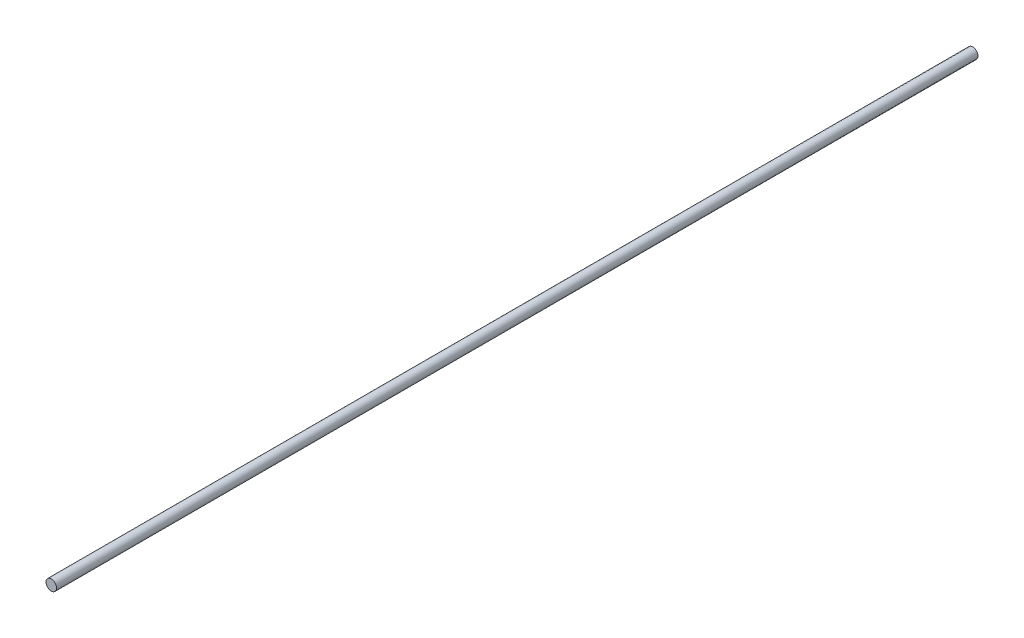
ISO-10303-21;
HEADER;
FILE_DESCRIPTION(('STEP AP214'),'2;1');
FILE_NAME('part.step','',(''),(''),'','','');
FILE_SCHEMA(('AUTOMOTIVE_DESIGN { 1 0 10303 214 1 1 1 1 }'));
ENDSEC;
DATA;
#1=APPLICATION_CONTEXT('core data for automotive mechanical design processes');
#2=APPLICATION_PROTOCOL_DEFINITION('international standard','automotive_design',2000,#1);
#3=PRODUCT_CONTEXT('',#1,'mechanical');
#4=PRODUCT('Part','Part','',(#3));
#5=PRODUCT_RELATED_PRODUCT_CATEGORY('part','',(#4));
#6=PRODUCT_DEFINITION_FORMATION('','',#4);
#7=PRODUCT_DEFINITION_CONTEXT('part definition',#1,'design');
#8=PRODUCT_DEFINITION('design','',#6,#7);
#9=PRODUCT_DEFINITION_SHAPE('','',#8);
#10=(LENGTH_UNIT() NAMED_UNIT(*) SI_UNIT(.MILLI.,.METRE.));
#11=(NAMED_UNIT(*) PLANE_ANGLE_UNIT() SI_UNIT($,.RADIAN.));
#12=(NAMED_UNIT(*) SI_UNIT($,.STERADIAN.) SOLID_ANGLE_UNIT());
#13=UNCERTAINTY_MEASURE_WITH_UNIT(LENGTH_MEASURE(1.E-05),#10,'distance_accuracy_value','');
#14=(GEOMETRIC_REPRESENTATION_CONTEXT(3) GLOBAL_UNCERTAINTY_ASSIGNED_CONTEXT((#13)) GLOBAL_UNIT_ASSIGNED_CONTEXT((#10,
#11,#12)) REPRESENTATION_CONTEXT('',''));
#15=CARTESIAN_POINT('',(0.,0.,0.));
#16=DIRECTION('',(0.,0.,1.));
#17=DIRECTION('',(1.,0.,0.));
#18=AXIS2_PLACEMENT_3D('',#15,#16,#17);
#19=CARTESIAN_POINT('',(0.,0.,700.));
#20=DIRECTION('',(0.,0.,-1.));
#21=DIRECTION('',(-1.,0.,0.));
#22=AXIS2_PLACEMENT_3D('',#19,#20,#21);
#23=CYLINDRICAL_SURFACE('',#22,4.);
#24=CARTESIAN_POINT('',(0.,0.,700.));
#25=DIRECTION('',(0.,0.,1.));
#26=DIRECTION('',(1.,0.,0.));
#27=AXIS2_PLACEMENT_3D('',#24,#25,#26);
#28=CIRCLE('',#27,4.);
#29=CARTESIAN_POINT('',(4.,0.,700.));
#30=VERTEX_POINT('',#29);
#31=EDGE_CURVE('E10',#30,#30,#28,.T.);
#32=ORIENTED_EDGE('',*,*,#31,.F.);
#33=EDGE_LOOP('',(#32));
#34=FACE_BOUND('',#33,.T.);
#35=CARTESIAN_POINT('',(0.,0.,0.));
#36=DIRECTION('',(0.,0.,1.));
#37=DIRECTION('',(1.,0.,0.));
#38=AXIS2_PLACEMENT_3D('',#35,#36,#37);
#39=CIRCLE('',#38,4.);
#40=CARTESIAN_POINT('',(4.,0.,0.));
#41=VERTEX_POINT('',#40);
#42=EDGE_CURVE('E46',#41,#41,#39,.T.);
#43=ORIENTED_EDGE('',*,*,#42,.T.);
#44=EDGE_LOOP('',(#43));
#45=FACE_BOUND('',#44,.T.);
#46=ADVANCED_FACE('F43',(#34,#45),#23,.T.);
#47=CARTESIAN_POINT('',(0.,0.,700.));
#48=DIRECTION('',(0.,0.,1.));
#49=DIRECTION('',(1.,0.,0.));
#50=AXIS2_PLACEMENT_3D('',#47,#48,#49);
#51=PLANE('',#50);
#52=ORIENTED_EDGE('',*,*,#31,.T.);
#53=EDGE_LOOP('',(#52));
#54=FACE_BOUND('',#53,.T.);
#55=ADVANCED_FACE('F60',(#54),#51,.T.);
#56=CARTESIAN_POINT('',(0.,0.,0.));
#57=DIRECTION('',(0.,0.,1.));
#58=DIRECTION('',(1.,0.,0.));
#59=AXIS2_PLACEMENT_3D('',#56,#57,#58);
#60=PLANE('',#59);
#61=ORIENTED_EDGE('',*,*,#42,.F.);
#62=EDGE_LOOP('',(#61));
#63=FACE_BOUND('',#62,.T.);
#64=ADVANCED_FACE('F58',(#63),#60,.F.);
#65=CLOSED_SHELL('',(#46,#55,#64));
#66=MANIFOLD_SOLID_BREP('B2',#65);
#67=ADVANCED_BREP_SHAPE_REPRESENTATION('',(#18,#66),#14);
#68=SHAPE_DEFINITION_REPRESENTATION(#9,#67);
ENDSEC;
END-ISO-10303-21;
